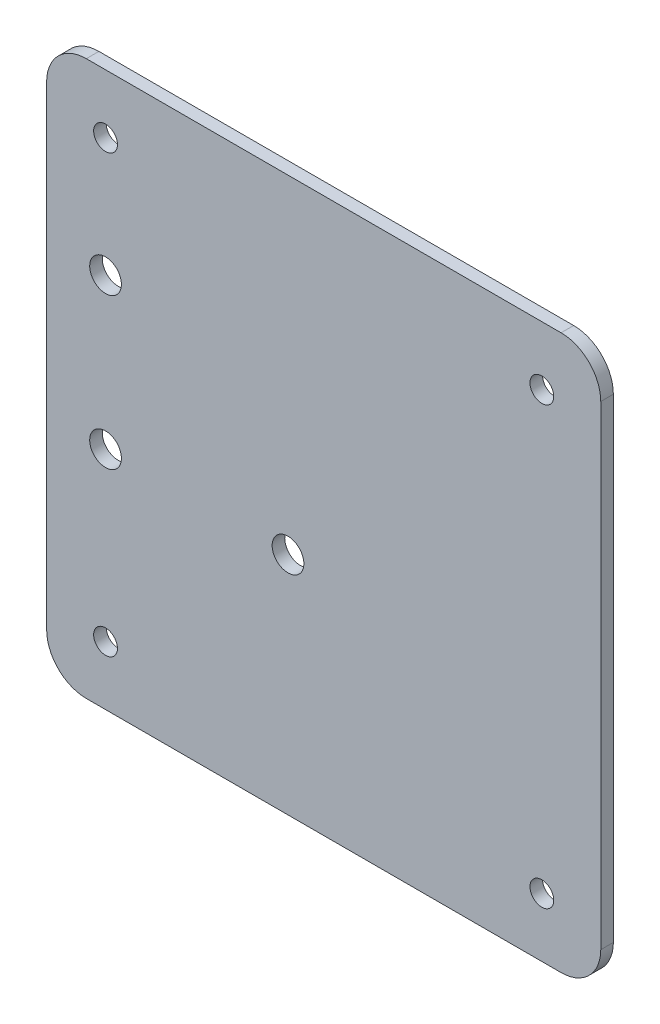
ISO-10303-21;
HEADER;
FILE_DESCRIPTION(('STEP AP214'),'2;1');
FILE_NAME('part.step','',(''),(''),'','','');
FILE_SCHEMA(('AUTOMOTIVE_DESIGN { 1 0 10303 214 1 1 1 1 }'));
ENDSEC;
DATA;
#1=APPLICATION_CONTEXT('core data for automotive mechanical design processes');
#2=APPLICATION_PROTOCOL_DEFINITION('international standard','automotive_design',2000,#1);
#3=PRODUCT_CONTEXT('',#1,'mechanical');
#4=PRODUCT('Part','Part','',(#3));
#5=PRODUCT_RELATED_PRODUCT_CATEGORY('part','',(#4));
#6=PRODUCT_DEFINITION_FORMATION('','',#4);
#7=PRODUCT_DEFINITION_CONTEXT('part definition',#1,'design');
#8=PRODUCT_DEFINITION('design','',#6,#7);
#9=PRODUCT_DEFINITION_SHAPE('','',#8);
#10=(LENGTH_UNIT() NAMED_UNIT(*) SI_UNIT(.MILLI.,.METRE.));
#11=(NAMED_UNIT(*) PLANE_ANGLE_UNIT() SI_UNIT($,.RADIAN.));
#12=(NAMED_UNIT(*) SI_UNIT($,.STERADIAN.) SOLID_ANGLE_UNIT());
#13=UNCERTAINTY_MEASURE_WITH_UNIT(LENGTH_MEASURE(1.E-05),#10,'distance_accuracy_value','');
#14=(GEOMETRIC_REPRESENTATION_CONTEXT(3) GLOBAL_UNCERTAINTY_ASSIGNED_CONTEXT((#13)) GLOBAL_UNIT_ASSIGNED_CONTEXT((#10,
#11,#12)) REPRESENTATION_CONTEXT('',''));
#15=CARTESIAN_POINT('',(0.,0.,0.));
#16=DIRECTION('',(0.,0.,1.));
#17=DIRECTION('',(1.,0.,0.));
#18=AXIS2_PLACEMENT_3D('',#15,#16,#17);
#19=CARTESIAN_POINT('',(66.6352687811833,1591.86,3.175));
#20=DIRECTION('',(0.,0.,-1.));
#21=DIRECTION('',(-1.,0.,0.));
#22=AXIS2_PLACEMENT_3D('',#19,#20,#21);
#23=CYLINDRICAL_SURFACE('',#22,10.);
#24=CARTESIAN_POINT('',(66.6352687811833,1591.86,0.));
#25=DIRECTION('',(0.,0.,1.));
#26=DIRECTION('',(1.,0.,0.));
#27=AXIS2_PLACEMENT_3D('',#24,#25,#26);
#28=CIRCLE('',#27,10.);
#29=CARTESIAN_POINT('',(56.6352687811833,1591.86,0.));
#30=VERTEX_POINT('',#29);
#31=CARTESIAN_POINT('',(66.6352687811833,1581.86,0.));
#32=VERTEX_POINT('',#31);
#33=EDGE_CURVE('E133',#30,#32,#28,.T.);
#34=ORIENTED_EDGE('',*,*,#33,.T.);
#35=DIRECTION('',(0.,0.,-1.));
#36=VECTOR('',#35,1.);
#37=CARTESIAN_POINT('',(66.6352687811833,1581.86,3.175));
#38=LINE('',#37,#36);
#39=CARTESIAN_POINT('',(66.6352687811833,1581.86,3.175));
#40=VERTEX_POINT('',#39);
#41=EDGE_CURVE('E11',#40,#32,#38,.T.);
#42=ORIENTED_EDGE('',*,*,#41,.F.);
#43=CARTESIAN_POINT('',(66.6352687811833,1591.86,3.175));
#44=DIRECTION('',(0.,0.,1.));
#45=DIRECTION('',(1.,0.,0.));
#46=AXIS2_PLACEMENT_3D('',#43,#44,#45);
#47=CIRCLE('',#46,10.);
#48=CARTESIAN_POINT('',(56.6352687811833,1591.86,3.175));
#49=VERTEX_POINT('',#48);
#50=EDGE_CURVE('E148',#49,#40,#47,.T.);
#51=ORIENTED_EDGE('',*,*,#50,.F.);
#52=DIRECTION('',(0.,0.,-1.));
#53=VECTOR('',#52,1.);
#54=CARTESIAN_POINT('',(56.6352687811833,1591.86,3.175));
#55=LINE('',#54,#53);
#56=EDGE_CURVE('E129',#49,#30,#55,.T.);
#57=ORIENTED_EDGE('',*,*,#56,.T.);
#58=EDGE_LOOP('',(#34,#42,#51,#57));
#59=FACE_BOUND('',#58,.T.);
#60=ADVANCED_FACE('F37',(#59),#23,.T.);
#61=CARTESIAN_POINT('',(66.6352687811833,1581.86,3.175));
#62=DIRECTION('',(0.,1.,0.));
#63=DIRECTION('',(0.,0.,1.));
#64=AXIS2_PLACEMENT_3D('',#61,#62,#63);
#65=PLANE('',#64);
#66=DIRECTION('',(1.,0.,0.));
#67=VECTOR('',#66,1.);
#68=CARTESIAN_POINT('',(66.6352687811833,1581.86,0.));
#69=LINE('',#68,#67);
#70=CARTESIAN_POINT('',(186.335268781183,1581.86,0.));
#71=VERTEX_POINT('',#70);
#72=EDGE_CURVE('E136',#32,#71,#69,.T.);
#73=ORIENTED_EDGE('',*,*,#72,.T.);
#74=DIRECTION('',(0.,0.,-1.));
#75=VECTOR('',#74,1.);
#76=CARTESIAN_POINT('',(186.335268781183,1581.86,3.175));
#77=LINE('',#76,#75);
#78=CARTESIAN_POINT('',(186.335268781183,1581.86,3.175));
#79=VERTEX_POINT('',#78);
#80=EDGE_CURVE('E45',#79,#71,#77,.T.);
#81=ORIENTED_EDGE('',*,*,#80,.F.);
#82=DIRECTION('',(1.,0.,0.));
#83=VECTOR('',#82,1.);
#84=CARTESIAN_POINT('',(66.6352687811833,1581.86,3.175));
#85=LINE('',#84,#83);
#86=EDGE_CURVE('E96',#40,#79,#85,.T.);
#87=ORIENTED_EDGE('',*,*,#86,.F.);
#88=ORIENTED_EDGE('',*,*,#41,.T.);
#89=EDGE_LOOP('',(#73,#81,#87,#88));
#90=FACE_BOUND('',#89,.T.);
#91=ADVANCED_FACE('F247',(#90),#65,.F.);
#92=CARTESIAN_POINT('',(186.335268781183,1591.86,3.175));
#93=DIRECTION('',(0.,0.,-1.));
#94=DIRECTION('',(-1.,0.,0.));
#95=AXIS2_PLACEMENT_3D('',#92,#93,#94);
#96=CYLINDRICAL_SURFACE('',#95,10.);
#97=CARTESIAN_POINT('',(186.335268781183,1591.86,0.));
#98=DIRECTION('',(0.,0.,1.));
#99=DIRECTION('',(1.,0.,0.));
#100=AXIS2_PLACEMENT_3D('',#97,#98,#99);
#101=CIRCLE('',#100,10.);
#102=CARTESIAN_POINT('',(196.335268781183,1591.86,0.));
#103=VERTEX_POINT('',#102);
#104=EDGE_CURVE('E139',#71,#103,#101,.T.);
#105=ORIENTED_EDGE('',*,*,#104,.T.);
#106=DIRECTION('',(0.,0.,-1.));
#107=VECTOR('',#106,1.);
#108=CARTESIAN_POINT('',(196.335268781183,1591.86,3.175));
#109=LINE('',#108,#107);
#110=CARTESIAN_POINT('',(196.335268781183,1591.86,3.175));
#111=VERTEX_POINT('',#110);
#112=EDGE_CURVE('E155',#111,#103,#109,.T.);
#113=ORIENTED_EDGE('',*,*,#112,.F.);
#114=CARTESIAN_POINT('',(186.335268781183,1591.86,3.175));
#115=DIRECTION('',(0.,0.,1.));
#116=DIRECTION('',(1.,0.,0.));
#117=AXIS2_PLACEMENT_3D('',#114,#115,#116);
#118=CIRCLE('',#117,10.);
#119=EDGE_CURVE('E163',#79,#111,#118,.T.);
#120=ORIENTED_EDGE('',*,*,#119,.F.);
#121=ORIENTED_EDGE('',*,*,#80,.T.);
#122=EDGE_LOOP('',(#105,#113,#120,#121));
#123=FACE_BOUND('',#122,.T.);
#124=ADVANCED_FACE('F161',(#123),#96,.T.);
#125=CARTESIAN_POINT('',(196.335268781183,1711.56,3.175));
#126=DIRECTION('',(-1.,0.,0.));
#127=DIRECTION('',(0.,-1.,0.));
#128=AXIS2_PLACEMENT_3D('',#125,#126,#127);
#129=PLANE('',#128);
#130=DIRECTION('',(0.,1.,0.));
#131=VECTOR('',#130,1.);
#132=CARTESIAN_POINT('',(196.335268781183,1711.56,0.));
#133=LINE('',#132,#131);
#134=CARTESIAN_POINT('',(196.335268781183,1711.56,0.));
#135=VERTEX_POINT('',#134);
#136=EDGE_CURVE('E141',#103,#135,#133,.T.);
#137=ORIENTED_EDGE('',*,*,#136,.T.);
#138=DIRECTION('',(0.,0.,-1.));
#139=VECTOR('',#138,1.);
#140=CARTESIAN_POINT('',(196.335268781183,1711.56,3.175));
#141=LINE('',#140,#139);
#142=CARTESIAN_POINT('',(196.335268781183,1711.56,3.175));
#143=VERTEX_POINT('',#142);
#144=EDGE_CURVE('E152',#143,#135,#141,.T.);
#145=ORIENTED_EDGE('',*,*,#144,.F.);
#146=DIRECTION('',(0.,1.,0.));
#147=VECTOR('',#146,1.);
#148=CARTESIAN_POINT('',(196.335268781183,1711.56,3.175));
#149=LINE('',#148,#147);
#150=EDGE_CURVE('E175',#111,#143,#149,.T.);
#151=ORIENTED_EDGE('',*,*,#150,.F.);
#152=ORIENTED_EDGE('',*,*,#112,.T.);
#153=EDGE_LOOP('',(#137,#145,#151,#152));
#154=FACE_BOUND('',#153,.T.);
#155=ADVANCED_FACE('F171',(#154),#129,.F.);
#156=CARTESIAN_POINT('',(186.335268781183,1711.56,3.175));
#157=DIRECTION('',(0.,0.,-1.));
#158=DIRECTION('',(-1.,0.,0.));
#159=AXIS2_PLACEMENT_3D('',#156,#157,#158);
#160=CYLINDRICAL_SURFACE('',#159,10.);
#161=CARTESIAN_POINT('',(186.335268781183,1711.56,0.));
#162=DIRECTION('',(0.,0.,1.));
#163=DIRECTION('',(-1.,0.,0.));
#164=AXIS2_PLACEMENT_3D('',#161,#162,#163);
#165=CIRCLE('',#164,10.);
#166=CARTESIAN_POINT('',(186.335268781183,1721.56,0.));
#167=VERTEX_POINT('',#166);
#168=EDGE_CURVE('E143',#135,#167,#165,.T.);
#169=ORIENTED_EDGE('',*,*,#168,.T.);
#170=DIRECTION('',(0.,0.,-1.));
#171=VECTOR('',#170,1.);
#172=CARTESIAN_POINT('',(186.335268781183,1721.56,3.175));
#173=LINE('',#172,#171);
#174=CARTESIAN_POINT('',(186.335268781183,1721.56,3.175));
#175=VERTEX_POINT('',#174);
#176=EDGE_CURVE('E124',#175,#167,#173,.T.);
#177=ORIENTED_EDGE('',*,*,#176,.F.);
#178=CARTESIAN_POINT('',(186.335268781183,1711.56,3.175));
#179=DIRECTION('',(0.,0.,1.));
#180=DIRECTION('',(-1.,0.,0.));
#181=AXIS2_PLACEMENT_3D('',#178,#179,#180);
#182=CIRCLE('',#181,10.);
#183=EDGE_CURVE('E115',#143,#175,#182,.T.);
#184=ORIENTED_EDGE('',*,*,#183,.F.);
#185=ORIENTED_EDGE('',*,*,#144,.T.);
#186=EDGE_LOOP('',(#169,#177,#184,#185));
#187=FACE_BOUND('',#186,.T.);
#188=ADVANCED_FACE('F174',(#187),#160,.T.);
#189=CARTESIAN_POINT('',(66.6352687811833,1721.56,3.175));
#190=DIRECTION('',(0.,-1.,0.));
#191=DIRECTION('',(0.,0.,-1.));
#192=AXIS2_PLACEMENT_3D('',#189,#190,#191);
#193=PLANE('',#192);
#194=DIRECTION('',(-1.,0.,0.));
#195=VECTOR('',#194,1.);
#196=CARTESIAN_POINT('',(66.6352687811833,1721.56,0.));
#197=LINE('',#196,#195);
#198=CARTESIAN_POINT('',(66.6352687811833,1721.56,0.));
#199=VERTEX_POINT('',#198);
#200=EDGE_CURVE('E123',#167,#199,#197,.T.);
#201=ORIENTED_EDGE('',*,*,#200,.T.);
#202=DIRECTION('',(0.,0.,-1.));
#203=VECTOR('',#202,1.);
#204=CARTESIAN_POINT('',(66.6352687811833,1721.56,3.175));
#205=LINE('',#204,#203);
#206=CARTESIAN_POINT('',(66.6352687811833,1721.56,3.175));
#207=VERTEX_POINT('',#206);
#208=EDGE_CURVE('E120',#207,#199,#205,.T.);
#209=ORIENTED_EDGE('',*,*,#208,.F.);
#210=DIRECTION('',(-1.,0.,0.));
#211=VECTOR('',#210,1.);
#212=CARTESIAN_POINT('',(66.6352687811833,1721.56,3.175));
#213=LINE('',#212,#211);
#214=EDGE_CURVE('E109',#175,#207,#213,.T.);
#215=ORIENTED_EDGE('',*,*,#214,.F.);
#216=ORIENTED_EDGE('',*,*,#176,.T.);
#217=EDGE_LOOP('',(#201,#209,#215,#216));
#218=FACE_BOUND('',#217,.T.);
#219=ADVANCED_FACE('F121',(#218),#193,.F.);
#220=CARTESIAN_POINT('',(66.6352687811833,1711.56,3.175));
#221=DIRECTION('',(0.,0.,-1.));
#222=DIRECTION('',(-1.,0.,0.));
#223=AXIS2_PLACEMENT_3D('',#220,#221,#222);
#224=CYLINDRICAL_SURFACE('',#223,10.);
#225=CARTESIAN_POINT('',(66.6352687811833,1711.56,0.));
#226=DIRECTION('',(0.,0.,1.));
#227=DIRECTION('',(1.,0.,0.));
#228=AXIS2_PLACEMENT_3D('',#225,#226,#227);
#229=CIRCLE('',#228,10.);
#230=CARTESIAN_POINT('',(56.6352687811833,1711.56,0.));
#231=VERTEX_POINT('',#230);
#232=EDGE_CURVE('E82',#199,#231,#229,.T.);
#233=ORIENTED_EDGE('',*,*,#232,.T.);
#234=DIRECTION('',(0.,0.,-1.));
#235=VECTOR('',#234,1.);
#236=CARTESIAN_POINT('',(56.6352687811833,1711.56,3.175));
#237=LINE('',#236,#235);
#238=CARTESIAN_POINT('',(56.6352687811833,1711.56,3.175));
#239=VERTEX_POINT('',#238);
#240=EDGE_CURVE('E125',#239,#231,#237,.T.);
#241=ORIENTED_EDGE('',*,*,#240,.F.);
#242=CARTESIAN_POINT('',(66.6352687811833,1711.56,3.175));
#243=DIRECTION('',(0.,0.,1.));
#244=DIRECTION('',(1.,0.,0.));
#245=AXIS2_PLACEMENT_3D('',#242,#243,#244);
#246=CIRCLE('',#245,10.);
#247=EDGE_CURVE('E113',#207,#239,#246,.T.);
#248=ORIENTED_EDGE('',*,*,#247,.F.);
#249=ORIENTED_EDGE('',*,*,#208,.T.);
#250=EDGE_LOOP('',(#233,#241,#248,#249));
#251=FACE_BOUND('',#250,.T.);
#252=ADVANCED_FACE('F127',(#251),#224,.T.);
#253=CARTESIAN_POINT('',(56.6352687811833,1711.56,3.175));
#254=DIRECTION('',(1.,0.,0.));
#255=DIRECTION('',(0.,1.,0.));
#256=AXIS2_PLACEMENT_3D('',#253,#254,#255);
#257=PLANE('',#256);
#258=DIRECTION('',(0.,-1.,0.));
#259=VECTOR('',#258,1.);
#260=CARTESIAN_POINT('',(56.6352687811833,1711.56,0.));
#261=LINE('',#260,#259);
#262=EDGE_CURVE('E88',#231,#30,#261,.T.);
#263=ORIENTED_EDGE('',*,*,#262,.T.);
#264=ORIENTED_EDGE('',*,*,#56,.F.);
#265=DIRECTION('',(0.,-1.,0.));
#266=VECTOR('',#265,1.);
#267=CARTESIAN_POINT('',(56.6352687811833,1711.56,3.175));
#268=LINE('',#267,#266);
#269=EDGE_CURVE('E53',#239,#49,#268,.T.);
#270=ORIENTED_EDGE('',*,*,#269,.F.);
#271=ORIENTED_EDGE('',*,*,#240,.T.);
#272=EDGE_LOOP('',(#263,#264,#270,#271));
#273=FACE_BOUND('',#272,.T.);
#274=ADVANCED_FACE('F254',(#273),#257,.F.);
#275=CARTESIAN_POINT('',(66.6352687811833,1591.86,3.175));
#276=DIRECTION('',(0.,0.,1.));
#277=DIRECTION('',(1.,0.,0.));
#278=AXIS2_PLACEMENT_3D('',#275,#276,#277);
#279=PLANE('',#278);
#280=CARTESIAN_POINT('',(181.485268781183,1706.71,3.175));
#281=DIRECTION('',(0.,0.,-1.));
#282=DIRECTION('',(-1.,0.,0.));
#283=AXIS2_PLACEMENT_3D('',#280,#281,#282);
#284=CIRCLE('',#283,2.99999999999999);
#285=CARTESIAN_POINT('',(178.485268781183,1706.71,3.175));
#286=VERTEX_POINT('',#285);
#287=EDGE_CURVE('E206',#286,#286,#284,.T.);
#288=ORIENTED_EDGE('',*,*,#287,.T.);
#289=EDGE_LOOP('',(#288));
#290=FACE_BOUND('',#289,.T.);
#291=CARTESIAN_POINT('',(181.485268781183,1596.71,3.175));
#292=DIRECTION('',(0.,0.,-1.));
#293=DIRECTION('',(-1.,0.,0.));
#294=AXIS2_PLACEMENT_3D('',#291,#292,#293);
#295=CIRCLE('',#294,2.99999999999999);
#296=CARTESIAN_POINT('',(178.485268781183,1596.71,3.175));
#297=VERTEX_POINT('',#296);
#298=EDGE_CURVE('E200',#297,#297,#295,.T.);
#299=ORIENTED_EDGE('',*,*,#298,.T.);
#300=EDGE_LOOP('',(#299));
#301=FACE_BOUND('',#300,.T.);
#302=CARTESIAN_POINT('',(71.4852687811833,1596.71,3.175));
#303=DIRECTION('',(0.,0.,-1.));
#304=DIRECTION('',(-1.,0.,0.));
#305=AXIS2_PLACEMENT_3D('',#302,#303,#304);
#306=CIRCLE('',#305,3.00000000000001);
#307=CARTESIAN_POINT('',(68.4852687811833,1596.71,3.175));
#308=VERTEX_POINT('',#307);
#309=EDGE_CURVE('E194',#308,#308,#306,.T.);
#310=ORIENTED_EDGE('',*,*,#309,.T.);
#311=EDGE_LOOP('',(#310));
#312=FACE_BOUND('',#311,.T.);
#313=CARTESIAN_POINT('',(71.4852687811833,1638.71,3.175));
#314=DIRECTION('',(0.,0.,-1.));
#315=DIRECTION('',(-1.,0.,0.));
#316=AXIS2_PLACEMENT_3D('',#313,#314,#315);
#317=CIRCLE('',#316,4.00000000000001);
#318=CARTESIAN_POINT('',(67.4852687811833,1638.71,3.175));
#319=VERTEX_POINT('',#318);
#320=EDGE_CURVE('E187',#319,#319,#317,.T.);
#321=ORIENTED_EDGE('',*,*,#320,.T.);
#322=EDGE_LOOP('',(#321));
#323=FACE_BOUND('',#322,.T.);
#324=CARTESIAN_POINT('',(71.4852687811833,1676.71,3.175));
#325=DIRECTION('',(0.,0.,-1.));
#326=DIRECTION('',(-1.,0.,0.));
#327=AXIS2_PLACEMENT_3D('',#324,#325,#326);
#328=CIRCLE('',#327,4.00000000000001);
#329=CARTESIAN_POINT('',(67.4852687811833,1676.71,3.175));
#330=VERTEX_POINT('',#329);
#331=EDGE_CURVE('E217',#330,#330,#328,.T.);
#332=ORIENTED_EDGE('',*,*,#331,.T.);
#333=EDGE_LOOP('',(#332));
#334=FACE_BOUND('',#333,.T.);
#335=CARTESIAN_POINT('',(117.485268781183,1638.71,3.175));
#336=DIRECTION('',(0.,0.,-1.));
#337=DIRECTION('',(-1.,0.,0.));
#338=AXIS2_PLACEMENT_3D('',#335,#336,#337);
#339=CIRCLE('',#338,4.00000000000001);
#340=CARTESIAN_POINT('',(113.485268781183,1638.71,3.175));
#341=VERTEX_POINT('',#340);
#342=EDGE_CURVE('E211',#341,#341,#339,.T.);
#343=ORIENTED_EDGE('',*,*,#342,.T.);
#344=EDGE_LOOP('',(#343));
#345=FACE_BOUND('',#344,.T.);
#346=CARTESIAN_POINT('',(71.4852687811834,1706.71,3.175));
#347=DIRECTION('',(0.,0.,-1.));
#348=DIRECTION('',(-1.,0.,0.));
#349=AXIS2_PLACEMENT_3D('',#346,#347,#348);
#350=CIRCLE('',#349,3.00000000000001);
#351=CARTESIAN_POINT('',(68.4852687811833,1706.71,3.175));
#352=VERTEX_POINT('',#351);
#353=EDGE_CURVE('E137',#352,#352,#350,.T.);
#354=ORIENTED_EDGE('',*,*,#353,.T.);
#355=EDGE_LOOP('',(#354));
#356=FACE_BOUND('',#355,.T.);
#357=ORIENTED_EDGE('',*,*,#50,.T.);
#358=ORIENTED_EDGE('',*,*,#86,.T.);
#359=ORIENTED_EDGE('',*,*,#119,.T.);
#360=ORIENTED_EDGE('',*,*,#150,.T.);
#361=ORIENTED_EDGE('',*,*,#183,.T.);
#362=ORIENTED_EDGE('',*,*,#214,.T.);
#363=ORIENTED_EDGE('',*,*,#247,.T.);
#364=ORIENTED_EDGE('',*,*,#269,.T.);
#365=EDGE_LOOP('',(#357,#358,#359,#360,#361,#362,#363,#364));
#366=FACE_BOUND('',#365,.T.);
#367=ADVANCED_FACE('F111',(#290,#301,#312,#323,#334,#345,#356,#366),#279,.T.);
#368=CARTESIAN_POINT('',(66.6352687811833,1591.86,0.));
#369=DIRECTION('',(0.,0.,1.));
#370=DIRECTION('',(1.,0.,0.));
#371=AXIS2_PLACEMENT_3D('',#368,#369,#370);
#372=PLANE('',#371);
#373=CARTESIAN_POINT('',(181.485268781183,1706.71,0.));
#374=DIRECTION('',(0.,0.,-1.));
#375=DIRECTION('',(-1.,0.,0.));
#376=AXIS2_PLACEMENT_3D('',#373,#374,#375);
#377=CIRCLE('',#376,2.99999999999999);
#378=CARTESIAN_POINT('',(178.485268781183,1706.71,0.));
#379=VERTEX_POINT('',#378);
#380=EDGE_CURVE('E184',#379,#379,#377,.T.);
#381=ORIENTED_EDGE('',*,*,#380,.F.);
#382=EDGE_LOOP('',(#381));
#383=FACE_BOUND('',#382,.T.);
#384=CARTESIAN_POINT('',(181.485268781183,1596.71,0.));
#385=DIRECTION('',(0.,0.,-1.));
#386=DIRECTION('',(-1.,0.,0.));
#387=AXIS2_PLACEMENT_3D('',#384,#385,#386);
#388=CIRCLE('',#387,2.99999999999999);
#389=CARTESIAN_POINT('',(178.485268781183,1596.71,0.));
#390=VERTEX_POINT('',#389);
#391=EDGE_CURVE('E203',#390,#390,#388,.T.);
#392=ORIENTED_EDGE('',*,*,#391,.F.);
#393=EDGE_LOOP('',(#392));
#394=FACE_BOUND('',#393,.T.);
#395=CARTESIAN_POINT('',(71.4852687811833,1596.71,0.));
#396=DIRECTION('',(0.,0.,-1.));
#397=DIRECTION('',(-1.,0.,0.));
#398=AXIS2_PLACEMENT_3D('',#395,#396,#397);
#399=CIRCLE('',#398,3.00000000000001);
#400=CARTESIAN_POINT('',(68.4852687811833,1596.71,0.));
#401=VERTEX_POINT('',#400);
#402=EDGE_CURVE('E197',#401,#401,#399,.T.);
#403=ORIENTED_EDGE('',*,*,#402,.F.);
#404=EDGE_LOOP('',(#403));
#405=FACE_BOUND('',#404,.T.);
#406=CARTESIAN_POINT('',(71.4852687811833,1638.71,0.));
#407=DIRECTION('',(0.,0.,-1.));
#408=DIRECTION('',(-1.,0.,0.));
#409=AXIS2_PLACEMENT_3D('',#406,#407,#408);
#410=CIRCLE('',#409,4.00000000000001);
#411=CARTESIAN_POINT('',(67.4852687811833,1638.71,0.));
#412=VERTEX_POINT('',#411);
#413=EDGE_CURVE('E190',#412,#412,#410,.T.);
#414=ORIENTED_EDGE('',*,*,#413,.F.);
#415=EDGE_LOOP('',(#414));
#416=FACE_BOUND('',#415,.T.);
#417=CARTESIAN_POINT('',(71.4852687811833,1676.71,0.));
#418=DIRECTION('',(0.,0.,-1.));
#419=DIRECTION('',(-1.,0.,0.));
#420=AXIS2_PLACEMENT_3D('',#417,#418,#419);
#421=CIRCLE('',#420,4.00000000000001);
#422=CARTESIAN_POINT('',(67.4852687811833,1676.71,0.));
#423=VERTEX_POINT('',#422);
#424=EDGE_CURVE('E191',#423,#423,#421,.T.);
#425=ORIENTED_EDGE('',*,*,#424,.F.);
#426=EDGE_LOOP('',(#425));
#427=FACE_BOUND('',#426,.T.);
#428=CARTESIAN_POINT('',(117.485268781183,1638.71,0.));
#429=DIRECTION('',(0.,0.,-1.));
#430=DIRECTION('',(-1.,0.,0.));
#431=AXIS2_PLACEMENT_3D('',#428,#429,#430);
#432=CIRCLE('',#431,4.00000000000001);
#433=CARTESIAN_POINT('',(113.485268781183,1638.71,0.));
#434=VERTEX_POINT('',#433);
#435=EDGE_CURVE('E214',#434,#434,#432,.T.);
#436=ORIENTED_EDGE('',*,*,#435,.F.);
#437=EDGE_LOOP('',(#436));
#438=FACE_BOUND('',#437,.T.);
#439=CARTESIAN_POINT('',(71.4852687811834,1706.71,0.));
#440=DIRECTION('',(0.,0.,-1.));
#441=DIRECTION('',(-1.,0.,0.));
#442=AXIS2_PLACEMENT_3D('',#439,#440,#441);
#443=CIRCLE('',#442,3.00000000000001);
#444=CARTESIAN_POINT('',(68.4852687811833,1706.71,0.));
#445=VERTEX_POINT('',#444);
#446=EDGE_CURVE('E181',#445,#445,#443,.T.);
#447=ORIENTED_EDGE('',*,*,#446,.F.);
#448=EDGE_LOOP('',(#447));
#449=FACE_BOUND('',#448,.T.);
#450=ORIENTED_EDGE('',*,*,#33,.F.);
#451=ORIENTED_EDGE('',*,*,#262,.F.);
#452=ORIENTED_EDGE('',*,*,#232,.F.);
#453=ORIENTED_EDGE('',*,*,#200,.F.);
#454=ORIENTED_EDGE('',*,*,#168,.F.);
#455=ORIENTED_EDGE('',*,*,#136,.F.);
#456=ORIENTED_EDGE('',*,*,#104,.F.);
#457=ORIENTED_EDGE('',*,*,#72,.F.);
#458=EDGE_LOOP('',(#450,#451,#452,#453,#454,#455,#456,#457));
#459=FACE_BOUND('',#458,.T.);
#460=ADVANCED_FACE('F167',(#383,#394,#405,#416,#427,#438,#449,#459),#372,.F.);
#461=CARTESIAN_POINT('',(71.4852687811834,1706.71,3.175));
#462=DIRECTION('',(0.,0.,-1.));
#463=DIRECTION('',(-1.,0.,0.));
#464=AXIS2_PLACEMENT_3D('',#461,#462,#463);
#465=CYLINDRICAL_SURFACE('',#464,3.00000000000001);
#466=ORIENTED_EDGE('',*,*,#353,.F.);
#467=EDGE_LOOP('',(#466));
#468=FACE_BOUND('',#467,.T.);
#469=ORIENTED_EDGE('',*,*,#446,.T.);
#470=EDGE_LOOP('',(#469));
#471=FACE_BOUND('',#470,.T.);
#472=ADVANCED_FACE('F227',(#468,#471),#465,.F.);
#473=CARTESIAN_POINT('',(117.485268781183,1638.71,3.175));
#474=DIRECTION('',(0.,0.,-1.));
#475=DIRECTION('',(-1.,0.,0.));
#476=AXIS2_PLACEMENT_3D('',#473,#474,#475);
#477=CYLINDRICAL_SURFACE('',#476,4.00000000000001);
#478=ORIENTED_EDGE('',*,*,#342,.F.);
#479=EDGE_LOOP('',(#478));
#480=FACE_BOUND('',#479,.T.);
#481=ORIENTED_EDGE('',*,*,#435,.T.);
#482=EDGE_LOOP('',(#481));
#483=FACE_BOUND('',#482,.T.);
#484=ADVANCED_FACE('F235',(#480,#483),#477,.F.);
#485=CARTESIAN_POINT('',(71.4852687811833,1676.71,3.175));
#486=DIRECTION('',(0.,0.,-1.));
#487=DIRECTION('',(-1.,0.,0.));
#488=AXIS2_PLACEMENT_3D('',#485,#486,#487);
#489=CYLINDRICAL_SURFACE('',#488,4.00000000000001);
#490=ORIENTED_EDGE('',*,*,#331,.F.);
#491=EDGE_LOOP('',(#490));
#492=FACE_BOUND('',#491,.T.);
#493=ORIENTED_EDGE('',*,*,#424,.T.);
#494=EDGE_LOOP('',(#493));
#495=FACE_BOUND('',#494,.T.);
#496=ADVANCED_FACE('F223',(#492,#495),#489,.F.);
#497=CARTESIAN_POINT('',(71.4852687811833,1638.71,3.175));
#498=DIRECTION('',(0.,0.,-1.));
#499=DIRECTION('',(-1.,0.,0.));
#500=AXIS2_PLACEMENT_3D('',#497,#498,#499);
#501=CYLINDRICAL_SURFACE('',#500,4.00000000000001);
#502=ORIENTED_EDGE('',*,*,#320,.F.);
#503=EDGE_LOOP('',(#502));
#504=FACE_BOUND('',#503,.T.);
#505=ORIENTED_EDGE('',*,*,#413,.T.);
#506=EDGE_LOOP('',(#505));
#507=FACE_BOUND('',#506,.T.);
#508=ADVANCED_FACE('F332',(#504,#507),#501,.F.);
#509=CARTESIAN_POINT('',(71.4852687811833,1596.71,3.175));
#510=DIRECTION('',(0.,0.,-1.));
#511=DIRECTION('',(-1.,0.,0.));
#512=AXIS2_PLACEMENT_3D('',#509,#510,#511);
#513=CYLINDRICAL_SURFACE('',#512,3.00000000000001);
#514=ORIENTED_EDGE('',*,*,#309,.F.);
#515=EDGE_LOOP('',(#514));
#516=FACE_BOUND('',#515,.T.);
#517=ORIENTED_EDGE('',*,*,#402,.T.);
#518=EDGE_LOOP('',(#517));
#519=FACE_BOUND('',#518,.T.);
#520=ADVANCED_FACE('F343',(#516,#519),#513,.F.);
#521=CARTESIAN_POINT('',(181.485268781183,1596.71,3.175));
#522=DIRECTION('',(0.,0.,-1.));
#523=DIRECTION('',(-1.,0.,0.));
#524=AXIS2_PLACEMENT_3D('',#521,#522,#523);
#525=CYLINDRICAL_SURFACE('',#524,2.99999999999999);
#526=ORIENTED_EDGE('',*,*,#298,.F.);
#527=EDGE_LOOP('',(#526));
#528=FACE_BOUND('',#527,.T.);
#529=ORIENTED_EDGE('',*,*,#391,.T.);
#530=EDGE_LOOP('',(#529));
#531=FACE_BOUND('',#530,.T.);
#532=ADVANCED_FACE('F353',(#528,#531),#525,.F.);
#533=CARTESIAN_POINT('',(181.485268781183,1706.71,3.175));
#534=DIRECTION('',(0.,0.,-1.));
#535=DIRECTION('',(-1.,0.,0.));
#536=AXIS2_PLACEMENT_3D('',#533,#534,#535);
#537=CYLINDRICAL_SURFACE('',#536,2.99999999999999);
#538=ORIENTED_EDGE('',*,*,#287,.F.);
#539=EDGE_LOOP('',(#538));
#540=FACE_BOUND('',#539,.T.);
#541=ORIENTED_EDGE('',*,*,#380,.T.);
#542=EDGE_LOOP('',(#541));
#543=FACE_BOUND('',#542,.T.);
#544=ADVANCED_FACE('F364',(#540,#543),#537,.F.);
#545=CLOSED_SHELL('',(#60,#91,#124,#155,#188,#219,#252,#274,#367,#460,#472,#484,#496,#508,#520,
#532,#544));
#546=MANIFOLD_SOLID_BREP('B2',#545);
#547=ADVANCED_BREP_SHAPE_REPRESENTATION('',(#18,#546),#14);
#548=SHAPE_DEFINITION_REPRESENTATION(#9,#547);
ENDSEC;
END-ISO-10303-21;
